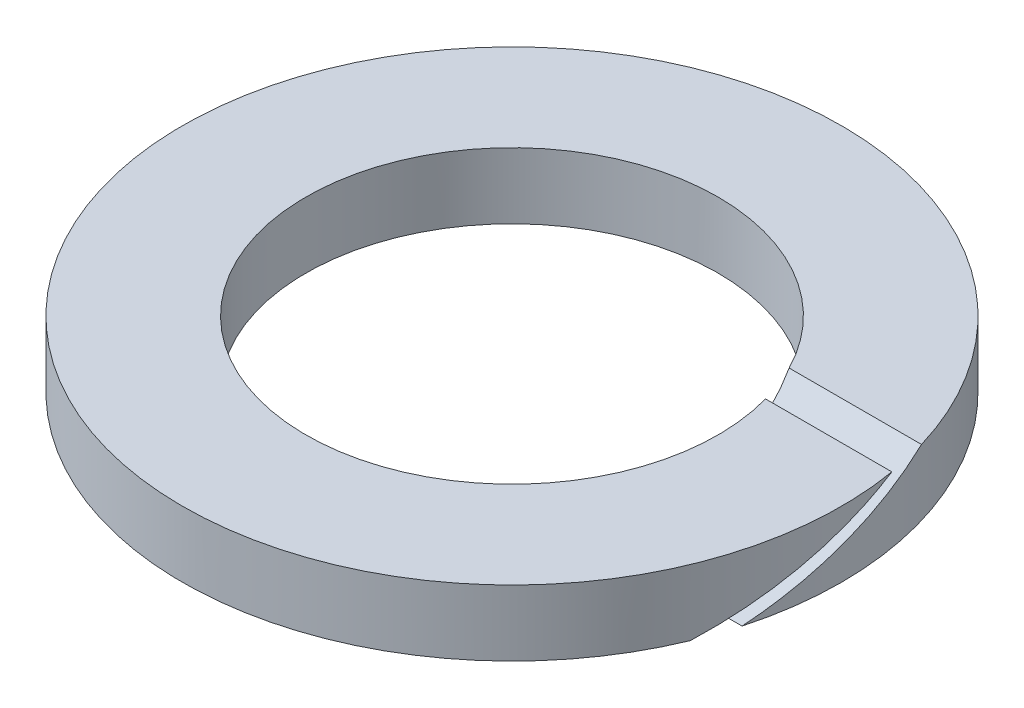
ISO-10303-21;
HEADER;
FILE_DESCRIPTION(('STEP AP214'),'2;1');
FILE_NAME('part.step','',(''),(''),'','','');
FILE_SCHEMA(('AUTOMOTIVE_DESIGN { 1 0 10303 214 1 1 1 1 }'));
ENDSEC;
DATA;
#1=APPLICATION_CONTEXT('core data for automotive mechanical design processes');
#2=APPLICATION_PROTOCOL_DEFINITION('international standard','automotive_design',2000,#1);
#3=PRODUCT_CONTEXT('',#1,'mechanical');
#4=PRODUCT('Part','Part','',(#3));
#5=PRODUCT_RELATED_PRODUCT_CATEGORY('part','',(#4));
#6=PRODUCT_DEFINITION_FORMATION('','',#4);
#7=PRODUCT_DEFINITION_CONTEXT('part definition',#1,'design');
#8=PRODUCT_DEFINITION('design','',#6,#7);
#9=PRODUCT_DEFINITION_SHAPE('','',#8);
#10=(LENGTH_UNIT() NAMED_UNIT(*) SI_UNIT(.MILLI.,.METRE.));
#11=(NAMED_UNIT(*) PLANE_ANGLE_UNIT() SI_UNIT($,.RADIAN.));
#12=(NAMED_UNIT(*) SI_UNIT($,.STERADIAN.) SOLID_ANGLE_UNIT());
#13=UNCERTAINTY_MEASURE_WITH_UNIT(LENGTH_MEASURE(1.E-05),#10,'distance_accuracy_value','');
#14=(GEOMETRIC_REPRESENTATION_CONTEXT(3) GLOBAL_UNCERTAINTY_ASSIGNED_CONTEXT((#13)) GLOBAL_UNIT_ASSIGNED_CONTEXT((#10,
#11,#12)) REPRESENTATION_CONTEXT('',''));
#15=CARTESIAN_POINT('',(0.,0.,0.));
#16=DIRECTION('',(0.,0.,1.));
#17=DIRECTION('',(1.,0.,0.));
#18=AXIS2_PLACEMENT_3D('',#15,#16,#17);
#19=CARTESIAN_POINT('',(0.,0.,0.));
#20=DIRECTION('',(0.,1.,0.));
#21=DIRECTION('',(0.,0.,1.));
#22=AXIS2_PLACEMENT_3D('',#19,#20,#21);
#23=PLANE('',#22);
#24=DIRECTION('',(1.,0.,0.));
#25=VECTOR('',#24,1.);
#26=CARTESIAN_POINT('',(1.11022302462516E-13,4.44089209850063E-13,5.06495001519736));
#27=LINE('',#26,#25);
#28=CARTESIAN_POINT('',(18.3643344922582,-2.22044604925031E-13,5.06495001519824));
#29=VERTEX_POINT('',#28);
#30=CARTESIAN_POINT('',(10.7822224102245,0.,5.06495001519802));
#31=VERTEX_POINT('',#30);
#32=EDGE_CURVE('E62',#29,#31,#27,.F.);
#33=ORIENTED_EDGE('',*,*,#32,.T.);
#34=CARTESIAN_POINT('',(0.,0.,0.));
#35=DIRECTION('',(0.,-1.,0.));
#36=DIRECTION('',(0.,0.,-1.));
#37=AXIS2_PLACEMENT_3D('',#34,#35,#36);
#38=CIRCLE('',#37,11.9126);
#39=CARTESIAN_POINT('',(9.41933167791853,0.,7.29288896812186));
#40=VERTEX_POINT('',#39);
#41=EDGE_CURVE('E66',#31,#40,#38,.F.);
#42=ORIENTED_EDGE('',*,*,#41,.T.);
#43=DIRECTION('',(1.,0.,0.));
#44=VECTOR('',#43,1.);
#45=CARTESIAN_POINT('',(-1.11022302462516E-13,0.,7.29288896812186));
#46=LINE('',#45,#44);
#47=CARTESIAN_POINT('',(17.5987576407722,0.,7.29288896812164));
#48=VERTEX_POINT('',#47);
#49=EDGE_CURVE('E82',#40,#48,#46,.T.);
#50=ORIENTED_EDGE('',*,*,#49,.T.);
#51=CARTESIAN_POINT('',(0.,0.,0.));
#52=DIRECTION('',(0.,-1.,0.));
#53=DIRECTION('',(0.,0.,-1.));
#54=AXIS2_PLACEMENT_3D('',#51,#52,#53);
#55=CIRCLE('',#54,19.05);
#56=EDGE_CURVE('E67',#29,#48,#55,.F.);
#57=ORIENTED_EDGE('',*,*,#56,.F.);
#58=EDGE_LOOP('',(#33,#42,#50,#57));
#59=FACE_BOUND('',#58,.T.);
#60=ADVANCED_FACE('F17',(#59),#23,.F.);
#61=CARTESIAN_POINT('',(1.11022302462516E-13,4.44089209850063E-13,5.06495001519736));
#62=DIRECTION('',(0.,-0.939692620785908,-0.342020143325673));
#63=DIRECTION('',(0.,0.342020143325673,-0.939692620785909));
#64=AXIS2_PLACEMENT_3D('',#61,#62,#63);
#65=PLANE('',#64);
#66=CARTESIAN_POINT('',(-5.55111512312578E-13,1.84349104357828,-6.66133814775094E-13));
#67=DIRECTION('',(0.,-0.939692620785908,-0.342020143325673));
#68=DIRECTION('',(0.,-0.342020143325673,0.939692620785909));
#69=AXIS2_PLACEMENT_3D('',#66,#67,#68);
#70=ELLIPSE('',#69,12.6771241323966,11.9126);
#71=CARTESIAN_POINT('',(10.6168869934161,3.81000000000009,-5.40293895292465));
#72=VERTEX_POINT('',#71);
#73=EDGE_CURVE('E70',#72,#31,#70,.T.);
#74=ORIENTED_EDGE('',*,*,#73,.T.);
#75=ORIENTED_EDGE('',*,*,#32,.F.);
#76=CARTESIAN_POINT('',(-5.55111512312578E-13,1.84349104357828,-6.66133814775094E-13));
#77=DIRECTION('',(0.,-0.939692620785908,-0.342020143325673));
#78=DIRECTION('',(0.,-0.342020143325673,0.939692620785909));
#79=AXIS2_PLACEMENT_3D('',#76,#77,#78);
#80=ELLIPSE('',#79,20.2725865656662,19.05);
#81=CARTESIAN_POINT('',(18.2677516588922,3.80999999999965,-5.40293895292399));
#82=VERTEX_POINT('',#81);
#83=EDGE_CURVE('E20',#82,#29,#80,.T.);
#84=ORIENTED_EDGE('',*,*,#83,.F.);
#85=DIRECTION('',(1.,0.,0.));
#86=VECTOR('',#85,1.);
#87=CARTESIAN_POINT('',(-5.55111512312578E-13,3.81000000000009,-5.40293895292487));
#88=LINE('',#87,#86);
#89=EDGE_CURVE('E72',#72,#82,#88,.T.);
#90=ORIENTED_EDGE('',*,*,#89,.F.);
#91=EDGE_LOOP('',(#74,#75,#84,#90));
#92=FACE_BOUND('',#91,.T.);
#93=ADVANCED_FACE('F71',(#92),#65,.F.);
#94=CARTESIAN_POINT('',(-5.55111512312578E-13,3.81000000000009,0.));
#95=DIRECTION('',(0.,-1.,0.));
#96=DIRECTION('',(0.,0.,-1.));
#97=AXIS2_PLACEMENT_3D('',#94,#95,#96);
#98=CYLINDRICAL_SURFACE('',#97,19.05);
#99=ORIENTED_EDGE('',*,*,#56,.T.);
#100=CARTESIAN_POINT('',(-3.33066907387547E-13,2.65439450620475,0.));
#101=DIRECTION('',(0.,0.939692620785908,0.342020143325674));
#102=DIRECTION('',(0.,-0.342020143325673,0.939692620785909));
#103=AXIS2_PLACEMENT_3D('',#100,#101,#102);
#104=ELLIPSE('',#103,20.2725865656662,19.05);
#105=CARTESIAN_POINT('',(18.7835533113412,3.81000000000009,-3.17500000000015));
#106=VERTEX_POINT('',#105);
#107=EDGE_CURVE('E83',#48,#106,#104,.T.);
#108=ORIENTED_EDGE('',*,*,#107,.T.);
#109=CARTESIAN_POINT('',(-5.55111512312578E-13,3.81000000000009,0.));
#110=DIRECTION('',(0.,-1.,0.));
#111=DIRECTION('',(0.,0.,-1.));
#112=AXIS2_PLACEMENT_3D('',#109,#110,#111);
#113=CIRCLE('',#112,19.05);
#114=EDGE_CURVE('E77',#82,#106,#113,.F.);
#115=ORIENTED_EDGE('',*,*,#114,.F.);
#116=ORIENTED_EDGE('',*,*,#83,.T.);
#117=EDGE_LOOP('',(#99,#108,#115,#116));
#118=FACE_BOUND('',#117,.T.);
#119=ADVANCED_FACE('F86',(#118),#98,.T.);
#120=CARTESIAN_POINT('',(1.11022302462516E-13,3.81000000000054,-3.17500000000037));
#121=DIRECTION('',(0.,0.939692620785908,0.342020143325674));
#122=DIRECTION('',(0.,-0.342020143325673,0.939692620785909));
#123=AXIS2_PLACEMENT_3D('',#120,#121,#122);
#124=PLANE('',#123);
#125=CARTESIAN_POINT('',(-3.33066907387547E-13,2.65439450620475,0.));
#126=DIRECTION('',(0.,0.939692620785908,0.342020143325674));
#127=DIRECTION('',(0.,-0.342020143325673,0.939692620785909));
#128=AXIS2_PLACEMENT_3D('',#125,#126,#127);
#129=ELLIPSE('',#128,12.6771241323966,11.9126);
#130=CARTESIAN_POINT('',(11.4816990798395,3.81000000000009,-3.17500000000037));
#131=VERTEX_POINT('',#130);
#132=EDGE_CURVE('E35',#40,#131,#129,.T.);
#133=ORIENTED_EDGE('',*,*,#132,.T.);
#134=DIRECTION('',(1.,0.,0.));
#135=VECTOR('',#134,1.);
#136=CARTESIAN_POINT('',(1.11022302462516E-13,3.81000000000054,-3.17500000000037));
#137=LINE('',#136,#135);
#138=EDGE_CURVE('E26',#106,#131,#137,.F.);
#139=ORIENTED_EDGE('',*,*,#138,.F.);
#140=ORIENTED_EDGE('',*,*,#107,.F.);
#141=ORIENTED_EDGE('',*,*,#49,.F.);
#142=EDGE_LOOP('',(#133,#139,#140,#141));
#143=FACE_BOUND('',#142,.T.);
#144=ADVANCED_FACE('F95',(#143),#124,.F.);
#145=CARTESIAN_POINT('',(-5.55111512312578E-13,3.81000000000009,0.));
#146=DIRECTION('',(0.,-1.,0.));
#147=DIRECTION('',(0.,0.,-1.));
#148=AXIS2_PLACEMENT_3D('',#145,#146,#147);
#149=CYLINDRICAL_SURFACE('',#148,11.9126);
#150=ORIENTED_EDGE('',*,*,#73,.F.);
#151=CARTESIAN_POINT('',(-5.55111512312578E-13,3.81000000000009,0.));
#152=DIRECTION('',(0.,-1.,0.));
#153=DIRECTION('',(0.,0.,-1.));
#154=AXIS2_PLACEMENT_3D('',#151,#152,#153);
#155=CIRCLE('',#154,11.9126);
#156=EDGE_CURVE('E11',#131,#72,#155,.T.);
#157=ORIENTED_EDGE('',*,*,#156,.F.);
#158=ORIENTED_EDGE('',*,*,#132,.F.);
#159=ORIENTED_EDGE('',*,*,#41,.F.);
#160=EDGE_LOOP('',(#150,#157,#158,#159));
#161=FACE_BOUND('',#160,.T.);
#162=ADVANCED_FACE('F75',(#161),#149,.F.);
#163=CARTESIAN_POINT('',(-5.55111512312578E-13,3.81000000000009,0.));
#164=DIRECTION('',(0.,1.,0.));
#165=DIRECTION('',(0.,0.,1.));
#166=AXIS2_PLACEMENT_3D('',#163,#164,#165);
#167=PLANE('',#166);
#168=ORIENTED_EDGE('',*,*,#156,.T.);
#169=ORIENTED_EDGE('',*,*,#89,.T.);
#170=ORIENTED_EDGE('',*,*,#114,.T.);
#171=ORIENTED_EDGE('',*,*,#138,.T.);
#172=EDGE_LOOP('',(#168,#169,#170,#171));
#173=FACE_BOUND('',#172,.T.);
#174=ADVANCED_FACE('F88',(#173),#167,.T.);
#175=CLOSED_SHELL('',(#60,#93,#119,#144,#162,#174));
#176=MANIFOLD_SOLID_BREP('B1',#175);
#177=ADVANCED_BREP_SHAPE_REPRESENTATION('',(#18,#176),#14);
#178=SHAPE_DEFINITION_REPRESENTATION(#9,#177);
ENDSEC;
END-ISO-10303-21;
